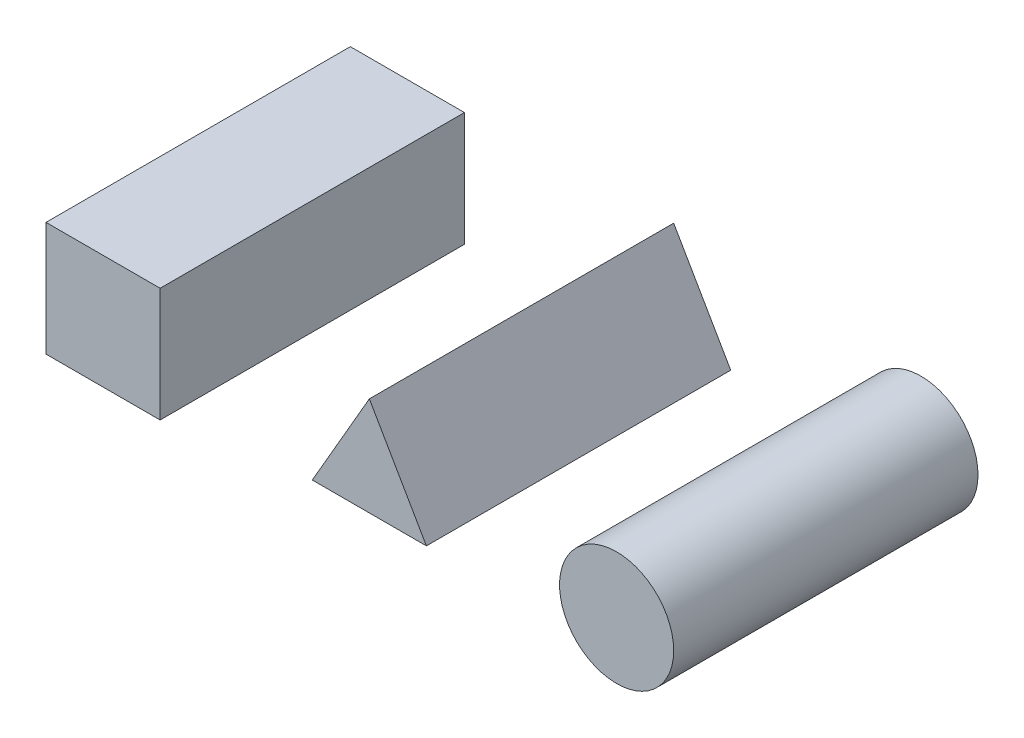
ISO-10303-21;
HEADER;
FILE_DESCRIPTION(('STEP AP214'),'2;1');
FILE_NAME('part.step','',(''),(''),'','','');
FILE_SCHEMA(('AUTOMOTIVE_DESIGN { 1 0 10303 214 1 1 1 1 }'));
ENDSEC;
DATA;
#1=APPLICATION_CONTEXT('core data for automotive mechanical design processes');
#2=APPLICATION_PROTOCOL_DEFINITION('international standard','automotive_design',2000,#1);
#3=PRODUCT_CONTEXT('',#1,'mechanical');
#4=PRODUCT('Part','Part','',(#3));
#5=PRODUCT_RELATED_PRODUCT_CATEGORY('part','',(#4));
#6=PRODUCT_DEFINITION_FORMATION('','',#4);
#7=PRODUCT_DEFINITION_CONTEXT('part definition',#1,'design');
#8=PRODUCT_DEFINITION('design','',#6,#7);
#9=PRODUCT_DEFINITION_SHAPE('','',#8);
#10=(LENGTH_UNIT() NAMED_UNIT(*) SI_UNIT(.MILLI.,.METRE.));
#11=(NAMED_UNIT(*) PLANE_ANGLE_UNIT() SI_UNIT($,.RADIAN.));
#12=(NAMED_UNIT(*) SI_UNIT($,.STERADIAN.) SOLID_ANGLE_UNIT());
#13=UNCERTAINTY_MEASURE_WITH_UNIT(LENGTH_MEASURE(1.E-05),#10,'distance_accuracy_value','');
#14=(GEOMETRIC_REPRESENTATION_CONTEXT(3) GLOBAL_UNCERTAINTY_ASSIGNED_CONTEXT((#13)) GLOBAL_UNIT_ASSIGNED_CONTEXT((#10,
#11,#12)) REPRESENTATION_CONTEXT('',''));
#15=CARTESIAN_POINT('',(0.,0.,0.));
#16=DIRECTION('',(0.,0.,1.));
#17=DIRECTION('',(1.,0.,0.));
#18=AXIS2_PLACEMENT_3D('',#15,#16,#17);
#19=CARTESIAN_POINT('',(65.,-1.19036740010594E-13,80.));
#20=DIRECTION('',(0.,0.,-1.));
#21=DIRECTION('',(-1.,0.,0.));
#22=AXIS2_PLACEMENT_3D('',#19,#20,#21);
#23=CYLINDRICAL_SURFACE('',#22,15.);
#24=CARTESIAN_POINT('',(65.,-1.19036740010594E-13,80.));
#25=DIRECTION('',(0.,0.,1.));
#26=DIRECTION('',(1.,0.,0.));
#27=AXIS2_PLACEMENT_3D('',#24,#25,#26);
#28=CIRCLE('',#27,15.);
#29=CARTESIAN_POINT('',(80.,-1.19036740010594E-13,80.));
#30=VERTEX_POINT('',#29);
#31=EDGE_CURVE('E11',#30,#30,#28,.T.);
#32=ORIENTED_EDGE('',*,*,#31,.F.);
#33=EDGE_LOOP('',(#32));
#34=FACE_BOUND('',#33,.T.);
#35=CARTESIAN_POINT('',(65.,-1.19036740010594E-13,0.));
#36=DIRECTION('',(0.,0.,1.));
#37=DIRECTION('',(1.,0.,0.));
#38=AXIS2_PLACEMENT_3D('',#35,#36,#37);
#39=CIRCLE('',#38,15.);
#40=CARTESIAN_POINT('',(80.,-1.19036740010594E-13,0.));
#41=VERTEX_POINT('',#40);
#42=EDGE_CURVE('E53',#41,#41,#39,.T.);
#43=ORIENTED_EDGE('',*,*,#42,.T.);
#44=EDGE_LOOP('',(#43));
#45=FACE_BOUND('',#44,.T.);
#46=ADVANCED_FACE('F50',(#34,#45),#23,.T.);
#47=CARTESIAN_POINT('',(0.,0.,80.));
#48=DIRECTION('',(0.,0.,1.));
#49=DIRECTION('',(1.,0.,0.));
#50=AXIS2_PLACEMENT_3D('',#47,#48,#49);
#51=PLANE('',#50);
#52=ORIENTED_EDGE('',*,*,#31,.T.);
#53=EDGE_LOOP('',(#52));
#54=FACE_BOUND('',#53,.T.);
#55=ADVANCED_FACE('F65',(#54),#51,.T.);
#56=CARTESIAN_POINT('',(0.,0.,0.));
#57=DIRECTION('',(0.,0.,1.));
#58=DIRECTION('',(1.,0.,0.));
#59=AXIS2_PLACEMENT_3D('',#56,#57,#58);
#60=PLANE('',#59);
#61=ORIENTED_EDGE('',*,*,#42,.F.);
#62=EDGE_LOOP('',(#61));
#63=FACE_BOUND('',#62,.T.);
#64=ADVANCED_FACE('F63',(#63),#60,.F.);
#65=CLOSED_SHELL('',(#46,#55,#64));
#66=MANIFOLD_SOLID_BREP('B2',#65);
#67=CARTESIAN_POINT('',(-55.,0.,80.));
#68=DIRECTION('',(1.,0.,0.));
#69=DIRECTION('',(0.,1.,0.));
#70=AXIS2_PLACEMENT_3D('',#67,#68,#69);
#71=PLANE('',#70);
#72=DIRECTION('',(0.,-1.,0.));
#73=VECTOR('',#72,1.);
#74=CARTESIAN_POINT('',(-55.,0.,0.));
#75=LINE('',#74,#73);
#76=CARTESIAN_POINT('',(-55.,14.9999999999998,0.));
#77=VERTEX_POINT('',#76);
#78=CARTESIAN_POINT('',(-55.,-15.0000000000002,0.));
#79=VERTEX_POINT('',#78);
#80=EDGE_CURVE('E169',#77,#79,#75,.T.);
#81=ORIENTED_EDGE('',*,*,#80,.F.);
#82=DIRECTION('',(0.,0.,-1.));
#83=VECTOR('',#82,1.);
#84=CARTESIAN_POINT('',(-55.,14.9999999999998,80.));
#85=LINE('',#84,#83);
#86=CARTESIAN_POINT('',(-55.,14.9999999999998,80.));
#87=VERTEX_POINT('',#86);
#88=EDGE_CURVE('E48',#87,#77,#85,.T.);
#89=ORIENTED_EDGE('',*,*,#88,.F.);
#90=DIRECTION('',(0.,-1.,0.));
#91=VECTOR('',#90,1.);
#92=CARTESIAN_POINT('',(-55.,0.,80.));
#93=LINE('',#92,#91);
#94=CARTESIAN_POINT('',(-55.,-15.0000000000002,80.));
#95=VERTEX_POINT('',#94);
#96=EDGE_CURVE('E160',#87,#95,#93,.T.);
#97=ORIENTED_EDGE('',*,*,#96,.T.);
#98=DIRECTION('',(0.,0.,-1.));
#99=VECTOR('',#98,1.);
#100=CARTESIAN_POINT('',(-55.,-15.0000000000002,80.));
#101=LINE('',#100,#99);
#102=EDGE_CURVE('E139',#95,#79,#101,.T.);
#103=ORIENTED_EDGE('',*,*,#102,.T.);
#104=EDGE_LOOP('',(#81,#89,#97,#103));
#105=FACE_BOUND('',#104,.T.);
#106=ADVANCED_FACE('F100',(#105),#71,.T.);
#107=CARTESIAN_POINT('',(0.,14.9999999999998,80.));
#108=DIRECTION('',(0.,1.,0.));
#109=DIRECTION('',(-1.,0.,0.));
#110=AXIS2_PLACEMENT_3D('',#107,#108,#109);
#111=PLANE('',#110);
#112=DIRECTION('',(1.,0.,0.));
#113=VECTOR('',#112,1.);
#114=CARTESIAN_POINT('',(0.,14.9999999999998,0.));
#115=LINE('',#114,#113);
#116=CARTESIAN_POINT('',(-85.,14.9999999999998,0.));
#117=VERTEX_POINT('',#116);
#118=EDGE_CURVE('E152',#117,#77,#115,.T.);
#119=ORIENTED_EDGE('',*,*,#118,.F.);
#120=DIRECTION('',(0.,0.,-1.));
#121=VECTOR('',#120,1.);
#122=CARTESIAN_POINT('',(-85.,14.9999999999998,80.));
#123=LINE('',#122,#121);
#124=CARTESIAN_POINT('',(-85.,14.9999999999998,80.));
#125=VERTEX_POINT('',#124);
#126=EDGE_CURVE('E109',#125,#117,#123,.T.);
#127=ORIENTED_EDGE('',*,*,#126,.F.);
#128=DIRECTION('',(1.,0.,0.));
#129=VECTOR('',#128,1.);
#130=CARTESIAN_POINT('',(0.,14.9999999999998,80.));
#131=LINE('',#130,#129);
#132=EDGE_CURVE('E150',#125,#87,#131,.T.);
#133=ORIENTED_EDGE('',*,*,#132,.T.);
#134=ORIENTED_EDGE('',*,*,#88,.T.);
#135=EDGE_LOOP('',(#119,#127,#133,#134));
#136=FACE_BOUND('',#135,.T.);
#137=ADVANCED_FACE('F148',(#136),#111,.T.);
#138=CARTESIAN_POINT('',(-85.,0.,80.));
#139=DIRECTION('',(1.,0.,0.));
#140=DIRECTION('',(0.,1.,0.));
#141=AXIS2_PLACEMENT_3D('',#138,#139,#140);
#142=PLANE('',#141);
#143=DIRECTION('',(0.,-1.,0.));
#144=VECTOR('',#143,1.);
#145=CARTESIAN_POINT('',(-85.,0.,0.));
#146=LINE('',#145,#144);
#147=CARTESIAN_POINT('',(-85.,-15.0000000000002,0.));
#148=VERTEX_POINT('',#147);
#149=EDGE_CURVE('E132',#117,#148,#146,.T.);
#150=ORIENTED_EDGE('',*,*,#149,.T.);
#151=DIRECTION('',(0.,0.,-1.));
#152=VECTOR('',#151,1.);
#153=CARTESIAN_POINT('',(-85.,-15.0000000000002,80.));
#154=LINE('',#153,#152);
#155=CARTESIAN_POINT('',(-85.,-15.0000000000002,80.));
#156=VERTEX_POINT('',#155);
#157=EDGE_CURVE('E154',#156,#148,#154,.T.);
#158=ORIENTED_EDGE('',*,*,#157,.F.);
#159=DIRECTION('',(0.,-1.,0.));
#160=VECTOR('',#159,1.);
#161=CARTESIAN_POINT('',(-85.,0.,80.));
#162=LINE('',#161,#160);
#163=EDGE_CURVE('E155',#125,#156,#162,.T.);
#164=ORIENTED_EDGE('',*,*,#163,.F.);
#165=ORIENTED_EDGE('',*,*,#126,.T.);
#166=EDGE_LOOP('',(#150,#158,#164,#165));
#167=FACE_BOUND('',#166,.T.);
#168=ADVANCED_FACE('F156',(#167),#142,.F.);
#169=CARTESIAN_POINT('',(0.,-15.0000000000002,80.));
#170=DIRECTION('',(0.,1.,0.));
#171=DIRECTION('',(-1.,0.,0.));
#172=AXIS2_PLACEMENT_3D('',#169,#170,#171);
#173=PLANE('',#172);
#174=DIRECTION('',(1.,0.,0.));
#175=VECTOR('',#174,1.);
#176=CARTESIAN_POINT('',(0.,-15.0000000000002,0.));
#177=LINE('',#176,#175);
#178=EDGE_CURVE('E164',#148,#79,#177,.T.);
#179=ORIENTED_EDGE('',*,*,#178,.T.);
#180=ORIENTED_EDGE('',*,*,#102,.F.);
#181=DIRECTION('',(1.,0.,0.));
#182=VECTOR('',#181,1.);
#183=CARTESIAN_POINT('',(0.,-15.0000000000002,80.));
#184=LINE('',#183,#182);
#185=EDGE_CURVE('E117',#156,#95,#184,.T.);
#186=ORIENTED_EDGE('',*,*,#185,.F.);
#187=ORIENTED_EDGE('',*,*,#157,.T.);
#188=EDGE_LOOP('',(#179,#180,#186,#187));
#189=FACE_BOUND('',#188,.T.);
#190=ADVANCED_FACE('F184',(#189),#173,.F.);
#191=CARTESIAN_POINT('',(0.,0.,80.));
#192=DIRECTION('',(0.,0.,1.));
#193=DIRECTION('',(1.,0.,0.));
#194=AXIS2_PLACEMENT_3D('',#191,#192,#193);
#195=PLANE('',#194);
#196=ORIENTED_EDGE('',*,*,#96,.F.);
#197=ORIENTED_EDGE('',*,*,#132,.F.);
#198=ORIENTED_EDGE('',*,*,#163,.T.);
#199=ORIENTED_EDGE('',*,*,#185,.T.);
#200=EDGE_LOOP('',(#196,#197,#198,#199));
#201=FACE_BOUND('',#200,.T.);
#202=ADVANCED_FACE('F159',(#201),#195,.T.);
#203=CARTESIAN_POINT('',(0.,0.,0.));
#204=DIRECTION('',(0.,0.,1.));
#205=DIRECTION('',(1.,0.,0.));
#206=AXIS2_PLACEMENT_3D('',#203,#204,#205);
#207=PLANE('',#206);
#208=ORIENTED_EDGE('',*,*,#80,.T.);
#209=ORIENTED_EDGE('',*,*,#178,.F.);
#210=ORIENTED_EDGE('',*,*,#149,.F.);
#211=ORIENTED_EDGE('',*,*,#118,.T.);
#212=EDGE_LOOP('',(#208,#209,#210,#211));
#213=FACE_BOUND('',#212,.T.);
#214=ADVANCED_FACE('F186',(#213),#207,.F.);
#215=CLOSED_SHELL('',(#106,#137,#168,#190,#202,#214));
#216=MANIFOLD_SOLID_BREP('B6',#215);
#217=CARTESIAN_POINT('',(0.,-8.66025403784454,80.));
#218=DIRECTION('',(0.,-1.,0.));
#219=DIRECTION('',(1.,0.,0.));
#220=AXIS2_PLACEMENT_3D('',#217,#218,#219);
#221=PLANE('',#220);
#222=DIRECTION('',(-1.,0.,0.));
#223=VECTOR('',#222,1.);
#224=CARTESIAN_POINT('',(0.,-8.66025403784454,0.));
#225=LINE('',#224,#223);
#226=CARTESIAN_POINT('',(15.,-8.66025403784453,0.));
#227=VERTEX_POINT('',#226);
#228=CARTESIAN_POINT('',(-15.,-8.66025403784454,0.));
#229=VERTEX_POINT('',#228);
#230=EDGE_CURVE('E270',#227,#229,#225,.T.);
#231=ORIENTED_EDGE('',*,*,#230,.F.);
#232=DIRECTION('',(0.,0.,-1.));
#233=VECTOR('',#232,1.);
#234=CARTESIAN_POINT('',(15.,-8.66025403784453,80.));
#235=LINE('',#234,#233);
#236=CARTESIAN_POINT('',(15.,-8.66025403784453,80.));
#237=VERTEX_POINT('',#236);
#238=EDGE_CURVE('E98',#237,#227,#235,.T.);
#239=ORIENTED_EDGE('',*,*,#238,.F.);
#240=DIRECTION('',(-1.,0.,0.));
#241=VECTOR('',#240,1.);
#242=CARTESIAN_POINT('',(0.,-8.66025403784454,80.));
#243=LINE('',#242,#241);
#244=CARTESIAN_POINT('',(-15.,-8.66025403784454,80.));
#245=VERTEX_POINT('',#244);
#246=EDGE_CURVE('E268',#237,#245,#243,.T.);
#247=ORIENTED_EDGE('',*,*,#246,.T.);
#248=DIRECTION('',(0.,0.,-1.));
#249=VECTOR('',#248,1.);
#250=CARTESIAN_POINT('',(-15.,-8.66025403784454,80.));
#251=LINE('',#250,#249);
#252=EDGE_CURVE('E252',#245,#229,#251,.T.);
#253=ORIENTED_EDGE('',*,*,#252,.T.);
#254=EDGE_LOOP('',(#231,#239,#247,#253));
#255=FACE_BOUND('',#254,.T.);
#256=ADVANCED_FACE('F236',(#255),#221,.T.);
#257=CARTESIAN_POINT('',(7.49999999999993,4.33012701892215,80.));
#258=DIRECTION('',(0.866025403784439,0.5,0.));
#259=DIRECTION('',(-0.5,0.866025403784439,0.));
#260=AXIS2_PLACEMENT_3D('',#257,#258,#259);
#261=PLANE('',#260);
#262=DIRECTION('',(0.5,-0.866025403784439,0.));
#263=VECTOR('',#262,1.);
#264=CARTESIAN_POINT('',(7.49999999999993,4.33012701892215,0.));
#265=LINE('',#264,#263);
#266=CARTESIAN_POINT('',(0.,17.3205080756886,0.));
#267=VERTEX_POINT('',#266);
#268=EDGE_CURVE('E286',#267,#227,#265,.T.);
#269=ORIENTED_EDGE('',*,*,#268,.F.);
#270=DIRECTION('',(0.,0.,-1.));
#271=VECTOR('',#270,1.);
#272=CARTESIAN_POINT('',(0.,17.3205080756886,80.));
#273=LINE('',#272,#271);
#274=CARTESIAN_POINT('',(0.,17.3205080756886,80.));
#275=VERTEX_POINT('',#274);
#276=EDGE_CURVE('E244',#275,#267,#273,.T.);
#277=ORIENTED_EDGE('',*,*,#276,.F.);
#278=DIRECTION('',(0.5,-0.866025403784439,0.));
#279=VECTOR('',#278,1.);
#280=CARTESIAN_POINT('',(7.49999999999993,4.33012701892215,80.));
#281=LINE('',#280,#279);
#282=EDGE_CURVE('E277',#275,#237,#281,.T.);
#283=ORIENTED_EDGE('',*,*,#282,.T.);
#284=ORIENTED_EDGE('',*,*,#238,.T.);
#285=EDGE_LOOP('',(#269,#277,#283,#284));
#286=FACE_BOUND('',#285,.T.);
#287=ADVANCED_FACE('F281',(#286),#261,.T.);
#288=CARTESIAN_POINT('',(-7.49999999999994,4.33012701892216,80.));
#289=DIRECTION('',(-0.866025403784439,0.5,0.));
#290=DIRECTION('',(-0.5,-0.866025403784439,0.));
#291=AXIS2_PLACEMENT_3D('',#288,#289,#290);
#292=PLANE('',#291);
#293=DIRECTION('',(0.5,0.866025403784439,0.));
#294=VECTOR('',#293,1.);
#295=CARTESIAN_POINT('',(-7.49999999999994,4.33012701892216,0.));
#296=LINE('',#295,#294);
#297=EDGE_CURVE('E279',#229,#267,#296,.T.);
#298=ORIENTED_EDGE('',*,*,#297,.F.);
#299=ORIENTED_EDGE('',*,*,#252,.F.);
#300=DIRECTION('',(0.5,0.866025403784439,0.));
#301=VECTOR('',#300,1.);
#302=CARTESIAN_POINT('',(-7.49999999999994,4.33012701892216,80.));
#303=LINE('',#302,#301);
#304=EDGE_CURVE('E278',#245,#275,#303,.T.);
#305=ORIENTED_EDGE('',*,*,#304,.T.);
#306=ORIENTED_EDGE('',*,*,#276,.T.);
#307=EDGE_LOOP('',(#298,#299,#305,#306));
#308=FACE_BOUND('',#307,.T.);
#309=ADVANCED_FACE('F292',(#308),#292,.T.);
#310=CARTESIAN_POINT('',(0.,0.,80.));
#311=DIRECTION('',(0.,0.,1.));
#312=DIRECTION('',(1.,0.,0.));
#313=AXIS2_PLACEMENT_3D('',#310,#311,#312);
#314=PLANE('',#313);
#315=ORIENTED_EDGE('',*,*,#246,.F.);
#316=ORIENTED_EDGE('',*,*,#282,.F.);
#317=ORIENTED_EDGE('',*,*,#304,.F.);
#318=EDGE_LOOP('',(#315,#316,#317));
#319=FACE_BOUND('',#318,.T.);
#320=ADVANCED_FACE('F276',(#319),#314,.T.);
#321=CARTESIAN_POINT('',(0.,0.,0.));
#322=DIRECTION('',(0.,0.,1.));
#323=DIRECTION('',(1.,0.,0.));
#324=AXIS2_PLACEMENT_3D('',#321,#322,#323);
#325=PLANE('',#324);
#326=ORIENTED_EDGE('',*,*,#230,.T.);
#327=ORIENTED_EDGE('',*,*,#297,.T.);
#328=ORIENTED_EDGE('',*,*,#268,.T.);
#329=EDGE_LOOP('',(#326,#327,#328));
#330=FACE_BOUND('',#329,.T.);
#331=ADVANCED_FACE('F291',(#330),#325,.F.);
#332=CLOSED_SHELL('',(#256,#287,#309,#320,#331));
#333=MANIFOLD_SOLID_BREP('B42',#332);
#334=ADVANCED_BREP_SHAPE_REPRESENTATION('',(#18,#66,#216,#333),#14);
#335=SHAPE_DEFINITION_REPRESENTATION(#9,#334);
ENDSEC;
END-ISO-10303-21;
